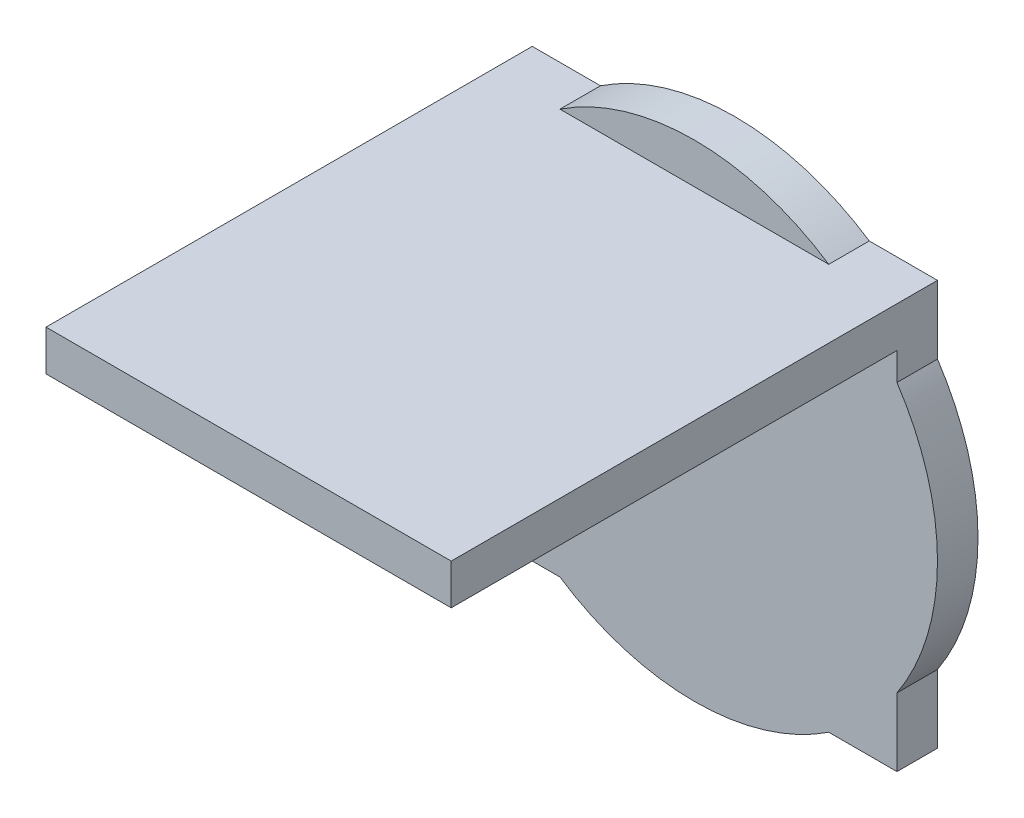
ISO-10303-21;
HEADER;
FILE_DESCRIPTION(('STEP AP214'),'2;1');
FILE_NAME('part.step','',(''),(''),'','','');
FILE_SCHEMA(('AUTOMOTIVE_DESIGN { 1 0 10303 214 1 1 1 1 }'));
ENDSEC;
DATA;
#1=APPLICATION_CONTEXT('core data for automotive mechanical design processes');
#2=APPLICATION_PROTOCOL_DEFINITION('international standard','automotive_design',2000,#1);
#3=PRODUCT_CONTEXT('',#1,'mechanical');
#4=PRODUCT('Part','Part','',(#3));
#5=PRODUCT_RELATED_PRODUCT_CATEGORY('part','',(#4));
#6=PRODUCT_DEFINITION_FORMATION('','',#4);
#7=PRODUCT_DEFINITION_CONTEXT('part definition',#1,'design');
#8=PRODUCT_DEFINITION('design','',#6,#7);
#9=PRODUCT_DEFINITION_SHAPE('','',#8);
#10=(LENGTH_UNIT() NAMED_UNIT(*) SI_UNIT(.MILLI.,.METRE.));
#11=(NAMED_UNIT(*) PLANE_ANGLE_UNIT() SI_UNIT($,.RADIAN.));
#12=(NAMED_UNIT(*) SI_UNIT($,.STERADIAN.) SOLID_ANGLE_UNIT());
#13=UNCERTAINTY_MEASURE_WITH_UNIT(LENGTH_MEASURE(1.E-05),#10,'distance_accuracy_value','');
#14=(GEOMETRIC_REPRESENTATION_CONTEXT(3) GLOBAL_UNCERTAINTY_ASSIGNED_CONTEXT((#13)) GLOBAL_UNIT_ASSIGNED_CONTEXT((#10,
#11,#12)) REPRESENTATION_CONTEXT('',''));
#15=CARTESIAN_POINT('',(0.,0.,0.));
#16=DIRECTION('',(0.,0.,1.));
#17=DIRECTION('',(1.,0.,0.));
#18=AXIS2_PLACEMENT_3D('',#15,#16,#17);
#19=CARTESIAN_POINT('',(0.,0.,50.));
#20=DIRECTION('',(0.,0.,1.));
#21=DIRECTION('',(1.,0.,0.));
#22=AXIS2_PLACEMENT_3D('',#19,#20,#21);
#23=PLANE('',#22);
#24=CARTESIAN_POINT('',(0.,0.,50.));
#25=DIRECTION('',(0.,0.,1.));
#26=DIRECTION('',(1.,0.,0.));
#27=AXIS2_PLACEMENT_3D('',#24,#25,#26);
#28=CIRCLE('',#27,300.);
#29=CARTESIAN_POINT('',(165.83123951777,250.,50.));
#30=VERTEX_POINT('',#29);
#31=CARTESIAN_POINT('',(-165.83123951777,250.,50.));
#32=VERTEX_POINT('',#31);
#33=EDGE_CURVE('E11',#30,#32,#28,.T.);
#34=ORIENTED_EDGE('',*,*,#33,.T.);
#35=DIRECTION('',(1.,0.,0.));
#36=VECTOR('',#35,1.);
#37=CARTESIAN_POINT('',(0.,250.,50.));
#38=LINE('',#37,#36);
#39=EDGE_CURVE('E180',#32,#30,#38,.T.);
#40=ORIENTED_EDGE('',*,*,#39,.T.);
#41=EDGE_LOOP('',(#34,#40));
#42=FACE_BOUND('',#41,.T.);
#43=ADVANCED_FACE('F41',(#42),#23,.T.);
#44=DIRECTION('',(0.,1.,0.));
#45=VECTOR('',#44,1.);
#46=CARTESIAN_POINT('',(250.,-250.,50.));
#47=LINE('',#46,#45);
#48=CARTESIAN_POINT('',(250.,165.83123951777,50.));
#49=VERTEX_POINT('',#48);
#50=CARTESIAN_POINT('',(250.,200.,50.));
#51=VERTEX_POINT('',#50);
#52=EDGE_CURVE('E186',#49,#51,#47,.T.);
#53=ORIENTED_EDGE('',*,*,#52,.T.);
#54=DIRECTION('',(-1.,0.,0.));
#55=VECTOR('',#54,1.);
#56=CARTESIAN_POINT('',(0.,200.,50.));
#57=LINE('',#56,#55);
#58=CARTESIAN_POINT('',(-250.,200.,50.));
#59=VERTEX_POINT('',#58);
#60=EDGE_CURVE('E178',#51,#59,#57,.T.);
#61=ORIENTED_EDGE('',*,*,#60,.T.);
#62=DIRECTION('',(0.,-1.,0.));
#63=VECTOR('',#62,1.);
#64=CARTESIAN_POINT('',(-250.,-250.,50.));
#65=LINE('',#64,#63);
#66=CARTESIAN_POINT('',(-250.,165.83123951777,50.));
#67=VERTEX_POINT('',#66);
#68=EDGE_CURVE('E187',#59,#67,#65,.T.);
#69=ORIENTED_EDGE('',*,*,#68,.T.);
#70=CARTESIAN_POINT('',(-250.,-165.83123951777,50.));
#71=VERTEX_POINT('',#70);
#72=EDGE_CURVE('E50',#67,#71,#28,.T.);
#73=ORIENTED_EDGE('',*,*,#72,.T.);
#74=CARTESIAN_POINT('',(-250.,-250.,50.));
#75=VERTEX_POINT('',#74);
#76=EDGE_CURVE('E185',#71,#75,#65,.T.);
#77=ORIENTED_EDGE('',*,*,#76,.T.);
#78=DIRECTION('',(1.,0.,0.));
#79=VECTOR('',#78,1.);
#80=CARTESIAN_POINT('',(-250.,-250.,50.));
#81=LINE('',#80,#79);
#82=CARTESIAN_POINT('',(-165.83123951777,-250.,50.));
#83=VERTEX_POINT('',#82);
#84=EDGE_CURVE('E190',#75,#83,#81,.T.);
#85=ORIENTED_EDGE('',*,*,#84,.T.);
#86=CARTESIAN_POINT('',(165.83123951777,-250.,50.));
#87=VERTEX_POINT('',#86);
#88=EDGE_CURVE('E233',#83,#87,#28,.T.);
#89=ORIENTED_EDGE('',*,*,#88,.T.);
#90=CARTESIAN_POINT('',(250.,-250.,50.));
#91=VERTEX_POINT('',#90);
#92=EDGE_CURVE('E189',#87,#91,#81,.T.);
#93=ORIENTED_EDGE('',*,*,#92,.T.);
#94=CARTESIAN_POINT('',(250.,-165.83123951777,50.));
#95=VERTEX_POINT('',#94);
#96=EDGE_CURVE('E182',#91,#95,#47,.T.);
#97=ORIENTED_EDGE('',*,*,#96,.T.);
#98=EDGE_CURVE('E51',#95,#49,#28,.T.);
#99=ORIENTED_EDGE('',*,*,#98,.T.);
#100=EDGE_LOOP('',(#53,#61,#69,#73,#77,#85,#89,#93,#97,#99));
#101=FACE_BOUND('',#100,.T.);
#102=ADVANCED_FACE('F260',(#101),#23,.T.);
#103=CARTESIAN_POINT('',(0.,0.,50.));
#104=DIRECTION('',(0.,0.,-1.));
#105=DIRECTION('',(-1.,0.,0.));
#106=AXIS2_PLACEMENT_3D('',#103,#104,#105);
#107=CYLINDRICAL_SURFACE('',#106,300.);
#108=DIRECTION('',(0.,0.,-1.));
#109=VECTOR('',#108,1.);
#110=CARTESIAN_POINT('',(250.,165.83123951777,50.));
#111=LINE('',#110,#109);
#112=CARTESIAN_POINT('',(250.,165.83123951777,0.));
#113=VERTEX_POINT('',#112);
#114=EDGE_CURVE('E232',#49,#113,#111,.T.);
#115=ORIENTED_EDGE('',*,*,#114,.F.);
#116=ORIENTED_EDGE('',*,*,#98,.F.);
#117=DIRECTION('',(0.,0.,-1.));
#118=VECTOR('',#117,1.);
#119=CARTESIAN_POINT('',(250.,-165.83123951777,50.));
#120=LINE('',#119,#118);
#121=CARTESIAN_POINT('',(250.,-165.83123951777,0.));
#122=VERTEX_POINT('',#121);
#123=EDGE_CURVE('E230',#122,#95,#120,.F.);
#124=ORIENTED_EDGE('',*,*,#123,.F.);
#125=CARTESIAN_POINT('',(0.,0.,0.));
#126=DIRECTION('',(0.,0.,1.));
#127=DIRECTION('',(1.,0.,0.));
#128=AXIS2_PLACEMENT_3D('',#125,#126,#127);
#129=CIRCLE('',#128,300.);
#130=EDGE_CURVE('E45',#122,#113,#129,.T.);
#131=ORIENTED_EDGE('',*,*,#130,.T.);
#132=EDGE_LOOP('',(#115,#116,#124,#131));
#133=FACE_BOUND('',#132,.T.);
#134=ADVANCED_FACE('F43',(#133),#107,.T.);
#135=DIRECTION('',(0.,0.,-1.));
#136=VECTOR('',#135,1.);
#137=CARTESIAN_POINT('',(-165.83123951777,250.,50.));
#138=LINE('',#137,#136);
#139=CARTESIAN_POINT('',(-165.83123951777,250.,0.));
#140=VERTEX_POINT('',#139);
#141=EDGE_CURVE('E227',#32,#140,#138,.T.);
#142=ORIENTED_EDGE('',*,*,#141,.F.);
#143=ORIENTED_EDGE('',*,*,#33,.F.);
#144=DIRECTION('',(0.,0.,-1.));
#145=VECTOR('',#144,1.);
#146=CARTESIAN_POINT('',(165.83123951777,250.,50.));
#147=LINE('',#146,#145);
#148=CARTESIAN_POINT('',(165.83123951777,250.,0.));
#149=VERTEX_POINT('',#148);
#150=EDGE_CURVE('E224',#149,#30,#147,.F.);
#151=ORIENTED_EDGE('',*,*,#150,.F.);
#152=EDGE_CURVE('E234',#149,#140,#129,.T.);
#153=ORIENTED_EDGE('',*,*,#152,.T.);
#154=EDGE_LOOP('',(#142,#143,#151,#153));
#155=FACE_BOUND('',#154,.T.);
#156=ADVANCED_FACE('F280',(#155),#107,.T.);
#157=DIRECTION('',(0.,0.,-1.));
#158=VECTOR('',#157,1.);
#159=CARTESIAN_POINT('',(-250.,-165.83123951777,50.));
#160=LINE('',#159,#158);
#161=CARTESIAN_POINT('',(-250.,-165.83123951777,0.));
#162=VERTEX_POINT('',#161);
#163=EDGE_CURVE('E221',#71,#162,#160,.T.);
#164=ORIENTED_EDGE('',*,*,#163,.F.);
#165=ORIENTED_EDGE('',*,*,#72,.F.);
#166=DIRECTION('',(0.,0.,-1.));
#167=VECTOR('',#166,1.);
#168=CARTESIAN_POINT('',(-250.,165.83123951777,50.));
#169=LINE('',#168,#167);
#170=CARTESIAN_POINT('',(-250.,165.83123951777,0.));
#171=VERTEX_POINT('',#170);
#172=EDGE_CURVE('E218',#171,#67,#169,.F.);
#173=ORIENTED_EDGE('',*,*,#172,.F.);
#174=EDGE_CURVE('E239',#171,#162,#129,.T.);
#175=ORIENTED_EDGE('',*,*,#174,.T.);
#176=EDGE_LOOP('',(#164,#165,#173,#175));
#177=FACE_BOUND('',#176,.T.);
#178=ADVANCED_FACE('F275',(#177),#107,.T.);
#179=DIRECTION('',(0.,0.,-1.));
#180=VECTOR('',#179,1.);
#181=CARTESIAN_POINT('',(165.83123951777,-250.,50.));
#182=LINE('',#181,#180);
#183=CARTESIAN_POINT('',(165.83123951777,-250.,0.));
#184=VERTEX_POINT('',#183);
#185=EDGE_CURVE('E215',#87,#184,#182,.T.);
#186=ORIENTED_EDGE('',*,*,#185,.F.);
#187=ORIENTED_EDGE('',*,*,#88,.F.);
#188=DIRECTION('',(0.,0.,-1.));
#189=VECTOR('',#188,1.);
#190=CARTESIAN_POINT('',(-165.83123951777,-250.,50.));
#191=LINE('',#190,#189);
#192=CARTESIAN_POINT('',(-165.83123951777,-250.,0.));
#193=VERTEX_POINT('',#192);
#194=EDGE_CURVE('E157',#193,#83,#191,.F.);
#195=ORIENTED_EDGE('',*,*,#194,.F.);
#196=EDGE_CURVE('E243',#193,#184,#129,.T.);
#197=ORIENTED_EDGE('',*,*,#196,.T.);
#198=EDGE_LOOP('',(#186,#187,#195,#197));
#199=FACE_BOUND('',#198,.T.);
#200=ADVANCED_FACE('F246',(#199),#107,.T.);
#201=CARTESIAN_POINT('',(0.,0.,0.));
#202=DIRECTION('',(0.,0.,1.));
#203=DIRECTION('',(1.,0.,0.));
#204=AXIS2_PLACEMENT_3D('',#201,#202,#203);
#205=PLANE('',#204);
#206=DIRECTION('',(-1.,0.,0.));
#207=VECTOR('',#206,1.);
#208=CARTESIAN_POINT('',(-250.,250.,0.));
#209=LINE('',#208,#207);
#210=CARTESIAN_POINT('',(-250.,250.,0.));
#211=VERTEX_POINT('',#210);
#212=EDGE_CURVE('E197',#140,#211,#209,.T.);
#213=ORIENTED_EDGE('',*,*,#212,.F.);
#214=ORIENTED_EDGE('',*,*,#152,.F.);
#215=CARTESIAN_POINT('',(250.,250.,0.));
#216=VERTEX_POINT('',#215);
#217=EDGE_CURVE('E198',#216,#149,#209,.T.);
#218=ORIENTED_EDGE('',*,*,#217,.F.);
#219=DIRECTION('',(0.,1.,0.));
#220=VECTOR('',#219,1.);
#221=CARTESIAN_POINT('',(250.,-250.,0.));
#222=LINE('',#221,#220);
#223=EDGE_CURVE('E153',#113,#216,#222,.T.);
#224=ORIENTED_EDGE('',*,*,#223,.F.);
#225=ORIENTED_EDGE('',*,*,#130,.F.);
#226=CARTESIAN_POINT('',(250.,-250.,0.));
#227=VERTEX_POINT('',#226);
#228=EDGE_CURVE('E194',#227,#122,#222,.T.);
#229=ORIENTED_EDGE('',*,*,#228,.F.);
#230=DIRECTION('',(1.,0.,0.));
#231=VECTOR('',#230,1.);
#232=CARTESIAN_POINT('',(-250.,-250.,0.));
#233=LINE('',#232,#231);
#234=EDGE_CURVE('E203',#184,#227,#233,.T.);
#235=ORIENTED_EDGE('',*,*,#234,.F.);
#236=ORIENTED_EDGE('',*,*,#196,.F.);
#237=CARTESIAN_POINT('',(-250.,-250.,0.));
#238=VERTEX_POINT('',#237);
#239=EDGE_CURVE('E204',#238,#193,#233,.T.);
#240=ORIENTED_EDGE('',*,*,#239,.F.);
#241=DIRECTION('',(0.,-1.,0.));
#242=VECTOR('',#241,1.);
#243=CARTESIAN_POINT('',(-250.,-250.,0.));
#244=LINE('',#243,#242);
#245=EDGE_CURVE('E200',#162,#238,#244,.T.);
#246=ORIENTED_EDGE('',*,*,#245,.F.);
#247=ORIENTED_EDGE('',*,*,#174,.F.);
#248=EDGE_CURVE('E201',#211,#171,#244,.T.);
#249=ORIENTED_EDGE('',*,*,#248,.F.);
#250=EDGE_LOOP('',(#213,#214,#218,#224,#225,#229,#235,#236,#240,#246,#247,#249));
#251=FACE_BOUND('',#250,.T.);
#252=ADVANCED_FACE('F256',(#251),#205,.F.);
#253=CARTESIAN_POINT('',(-250.,-250.,50.));
#254=DIRECTION('',(0.,1.,0.));
#255=DIRECTION('',(0.,0.,1.));
#256=AXIS2_PLACEMENT_3D('',#253,#254,#255);
#257=PLANE('',#256);
#258=ORIENTED_EDGE('',*,*,#239,.T.);
#259=ORIENTED_EDGE('',*,*,#194,.T.);
#260=ORIENTED_EDGE('',*,*,#84,.F.);
#261=DIRECTION('',(0.,0.,-1.));
#262=VECTOR('',#261,1.);
#263=CARTESIAN_POINT('',(-250.,-250.,50.));
#264=LINE('',#263,#262);
#265=EDGE_CURVE('E209',#75,#238,#264,.T.);
#266=ORIENTED_EDGE('',*,*,#265,.T.);
#267=EDGE_LOOP('',(#258,#259,#260,#266));
#268=FACE_BOUND('',#267,.T.);
#269=ADVANCED_FACE('F263',(#268),#257,.F.);
#270=CARTESIAN_POINT('',(-250.,-250.,50.));
#271=DIRECTION('',(1.,0.,0.));
#272=DIRECTION('',(0.,0.,-1.));
#273=AXIS2_PLACEMENT_3D('',#270,#271,#272);
#274=PLANE('',#273);
#275=ORIENTED_EDGE('',*,*,#76,.F.);
#276=ORIENTED_EDGE('',*,*,#163,.T.);
#277=ORIENTED_EDGE('',*,*,#245,.T.);
#278=ORIENTED_EDGE('',*,*,#265,.F.);
#279=EDGE_LOOP('',(#275,#276,#277,#278));
#280=FACE_BOUND('',#279,.T.);
#281=ADVANCED_FACE('F271',(#280),#274,.F.);
#282=ORIENTED_EDGE('',*,*,#92,.F.);
#283=ORIENTED_EDGE('',*,*,#185,.T.);
#284=ORIENTED_EDGE('',*,*,#234,.T.);
#285=DIRECTION('',(0.,0.,-1.));
#286=VECTOR('',#285,1.);
#287=CARTESIAN_POINT('',(250.,-250.,50.));
#288=LINE('',#287,#286);
#289=EDGE_CURVE('E193',#91,#227,#288,.T.);
#290=ORIENTED_EDGE('',*,*,#289,.F.);
#291=EDGE_LOOP('',(#282,#283,#284,#290));
#292=FACE_BOUND('',#291,.T.);
#293=ADVANCED_FACE('F252',(#292),#257,.F.);
#294=CARTESIAN_POINT('',(250.,-250.,50.));
#295=DIRECTION('',(-1.,0.,0.));
#296=DIRECTION('',(0.,0.,1.));
#297=AXIS2_PLACEMENT_3D('',#294,#295,#296);
#298=PLANE('',#297);
#299=ORIENTED_EDGE('',*,*,#228,.T.);
#300=ORIENTED_EDGE('',*,*,#123,.T.);
#301=ORIENTED_EDGE('',*,*,#96,.F.);
#302=ORIENTED_EDGE('',*,*,#289,.T.);
#303=EDGE_LOOP('',(#299,#300,#301,#302));
#304=FACE_BOUND('',#303,.T.);
#305=ADVANCED_FACE('F258',(#304),#298,.F.);
#306=DIRECTION('',(0.,0.,-1.));
#307=VECTOR('',#306,1.);
#308=CARTESIAN_POINT('',(250.,250.,50.));
#309=LINE('',#308,#307);
#310=CARTESIAN_POINT('',(250.,250.,600.));
#311=VERTEX_POINT('',#310);
#312=EDGE_CURVE('E145',#311,#216,#309,.T.);
#313=ORIENTED_EDGE('',*,*,#312,.F.);
#314=DIRECTION('',(0.,1.,0.));
#315=VECTOR('',#314,1.);
#316=CARTESIAN_POINT('',(250.,200.,600.));
#317=LINE('',#316,#315);
#318=CARTESIAN_POINT('',(250.,200.,600.));
#319=VERTEX_POINT('',#318);
#320=EDGE_CURVE('E150',#319,#311,#317,.T.);
#321=ORIENTED_EDGE('',*,*,#320,.F.);
#322=DIRECTION('',(0.,0.,-1.));
#323=VECTOR('',#322,1.);
#324=CARTESIAN_POINT('',(250.,200.,600.));
#325=LINE('',#324,#323);
#326=EDGE_CURVE('E175',#319,#51,#325,.T.);
#327=ORIENTED_EDGE('',*,*,#326,.T.);
#328=ORIENTED_EDGE('',*,*,#52,.F.);
#329=ORIENTED_EDGE('',*,*,#114,.T.);
#330=ORIENTED_EDGE('',*,*,#223,.T.);
#331=EDGE_LOOP('',(#313,#321,#327,#328,#329,#330));
#332=FACE_BOUND('',#331,.T.);
#333=ADVANCED_FACE('F147',(#332),#298,.F.);
#334=CARTESIAN_POINT('',(-250.,250.,50.));
#335=DIRECTION('',(0.,-1.,0.));
#336=DIRECTION('',(0.,0.,-1.));
#337=AXIS2_PLACEMENT_3D('',#334,#335,#336);
#338=PLANE('',#337);
#339=DIRECTION('',(0.,0.,-1.));
#340=VECTOR('',#339,1.);
#341=CARTESIAN_POINT('',(-250.,250.,50.));
#342=LINE('',#341,#340);
#343=CARTESIAN_POINT('',(-250.,250.,600.));
#344=VERTEX_POINT('',#343);
#345=EDGE_CURVE('E158',#344,#211,#342,.T.);
#346=ORIENTED_EDGE('',*,*,#345,.F.);
#347=DIRECTION('',(-1.,0.,0.));
#348=VECTOR('',#347,1.);
#349=CARTESIAN_POINT('',(-250.,250.,600.));
#350=LINE('',#349,#348);
#351=EDGE_CURVE('E161',#311,#344,#350,.T.);
#352=ORIENTED_EDGE('',*,*,#351,.F.);
#353=ORIENTED_EDGE('',*,*,#312,.T.);
#354=ORIENTED_EDGE('',*,*,#217,.T.);
#355=ORIENTED_EDGE('',*,*,#150,.T.);
#356=ORIENTED_EDGE('',*,*,#39,.F.);
#357=ORIENTED_EDGE('',*,*,#141,.T.);
#358=ORIENTED_EDGE('',*,*,#212,.T.);
#359=EDGE_LOOP('',(#346,#352,#353,#354,#355,#356,#357,#358));
#360=FACE_BOUND('',#359,.T.);
#361=ADVANCED_FACE('F162',(#360),#338,.F.);
#362=ORIENTED_EDGE('',*,*,#248,.T.);
#363=ORIENTED_EDGE('',*,*,#172,.T.);
#364=ORIENTED_EDGE('',*,*,#68,.F.);
#365=DIRECTION('',(0.,0.,-1.));
#366=VECTOR('',#365,1.);
#367=CARTESIAN_POINT('',(-250.,200.,600.));
#368=LINE('',#367,#366);
#369=CARTESIAN_POINT('',(-250.,200.,600.));
#370=VERTEX_POINT('',#369);
#371=EDGE_CURVE('E58',#370,#59,#368,.T.);
#372=ORIENTED_EDGE('',*,*,#371,.F.);
#373=DIRECTION('',(0.,-1.,0.));
#374=VECTOR('',#373,1.);
#375=CARTESIAN_POINT('',(-250.,200.,600.));
#376=LINE('',#375,#374);
#377=EDGE_CURVE('E166',#344,#370,#376,.T.);
#378=ORIENTED_EDGE('',*,*,#377,.F.);
#379=ORIENTED_EDGE('',*,*,#345,.T.);
#380=EDGE_LOOP('',(#362,#363,#364,#372,#378,#379));
#381=FACE_BOUND('',#380,.T.);
#382=ADVANCED_FACE('F278',(#381),#274,.F.);
#383=CARTESIAN_POINT('',(-250.,200.,600.));
#384=DIRECTION('',(0.,1.,0.));
#385=DIRECTION('',(0.,0.,1.));
#386=AXIS2_PLACEMENT_3D('',#383,#384,#385);
#387=PLANE('',#386);
#388=ORIENTED_EDGE('',*,*,#60,.F.);
#389=ORIENTED_EDGE('',*,*,#326,.F.);
#390=DIRECTION('',(1.,0.,0.));
#391=VECTOR('',#390,1.);
#392=CARTESIAN_POINT('',(-250.,200.,600.));
#393=LINE('',#392,#391);
#394=EDGE_CURVE('E169',#370,#319,#393,.T.);
#395=ORIENTED_EDGE('',*,*,#394,.F.);
#396=ORIENTED_EDGE('',*,*,#371,.T.);
#397=EDGE_LOOP('',(#388,#389,#395,#396));
#398=FACE_BOUND('',#397,.T.);
#399=ADVANCED_FACE('F304',(#398),#387,.F.);
#400=CARTESIAN_POINT('',(0.,0.,600.));
#401=DIRECTION('',(0.,0.,-1.));
#402=DIRECTION('',(-1.,0.,0.));
#403=AXIS2_PLACEMENT_3D('',#400,#401,#402);
#404=PLANE('',#403);
#405=ORIENTED_EDGE('',*,*,#320,.T.);
#406=ORIENTED_EDGE('',*,*,#351,.T.);
#407=ORIENTED_EDGE('',*,*,#377,.T.);
#408=ORIENTED_EDGE('',*,*,#394,.T.);
#409=EDGE_LOOP('',(#405,#406,#407,#408));
#410=FACE_BOUND('',#409,.T.);
#411=ADVANCED_FACE('F168',(#410),#404,.F.);
#412=CLOSED_SHELL('',(#43,#102,#134,#156,#178,#200,#252,#269,#281,#293,#305,#333,#361,#382,#399,#411));
#413=MANIFOLD_SOLID_BREP('B2',#412);
#414=ADVANCED_BREP_SHAPE_REPRESENTATION('',(#18,#413),#14);
#415=SHAPE_DEFINITION_REPRESENTATION(#9,#414);
ENDSEC;
END-ISO-10303-21;
